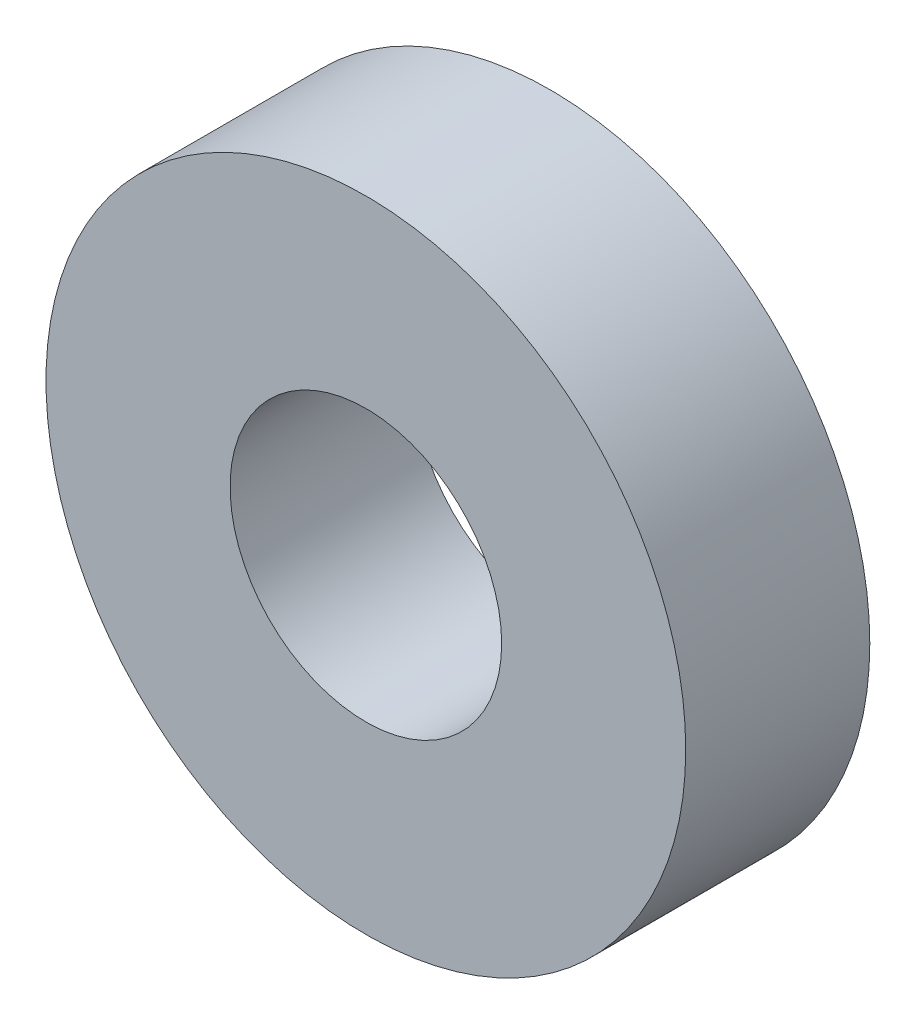
ISO-10303-21;
HEADER;
FILE_DESCRIPTION(('STEP AP214'),'2;1');
FILE_NAME('part.step','',(''),(''),'','','');
FILE_SCHEMA(('AUTOMOTIVE_DESIGN { 1 0 10303 214 1 1 1 1 }'));
ENDSEC;
DATA;
#1=APPLICATION_CONTEXT('core data for automotive mechanical design processes');
#2=APPLICATION_PROTOCOL_DEFINITION('international standard','automotive_design',2000,#1);
#3=PRODUCT_CONTEXT('',#1,'mechanical');
#4=PRODUCT('Part','Part','',(#3));
#5=PRODUCT_RELATED_PRODUCT_CATEGORY('part','',(#4));
#6=PRODUCT_DEFINITION_FORMATION('','',#4);
#7=PRODUCT_DEFINITION_CONTEXT('part definition',#1,'design');
#8=PRODUCT_DEFINITION('design','',#6,#7);
#9=PRODUCT_DEFINITION_SHAPE('','',#8);
#10=(LENGTH_UNIT() NAMED_UNIT(*) SI_UNIT(.MILLI.,.METRE.));
#11=(NAMED_UNIT(*) PLANE_ANGLE_UNIT() SI_UNIT($,.RADIAN.));
#12=(NAMED_UNIT(*) SI_UNIT($,.STERADIAN.) SOLID_ANGLE_UNIT());
#13=UNCERTAINTY_MEASURE_WITH_UNIT(LENGTH_MEASURE(1.E-05),#10,'distance_accuracy_value','');
#14=(GEOMETRIC_REPRESENTATION_CONTEXT(3) GLOBAL_UNCERTAINTY_ASSIGNED_CONTEXT((#13)) GLOBAL_UNIT_ASSIGNED_CONTEXT((#10,
#11,#12)) REPRESENTATION_CONTEXT('',''));
#15=CARTESIAN_POINT('',(0.,0.,0.));
#16=DIRECTION('',(0.,0.,1.));
#17=DIRECTION('',(1.,0.,0.));
#18=AXIS2_PLACEMENT_3D('',#15,#16,#17);
#19=CARTESIAN_POINT('',(-82.5618773380587,31.810605680252,25.4));
#20=DIRECTION('',(0.,0.,1.));
#21=DIRECTION('',(1.,0.,0.));
#22=AXIS2_PLACEMENT_3D('',#19,#20,#21);
#23=PLANE('',#22);
#24=CARTESIAN_POINT('',(-82.5618773380587,31.810605680252,25.4));
#25=DIRECTION('',(0.,0.,1.));
#26=DIRECTION('',(1.,0.,0.));
#27=AXIS2_PLACEMENT_3D('',#24,#25,#26);
#28=CIRCLE('',#27,44.137106544);
#29=CARTESIAN_POINT('',(-38.4247707940587,31.810605680252,25.4));
#30=VERTEX_POINT('',#29);
#31=EDGE_CURVE('E10',#30,#30,#28,.T.);
#32=ORIENTED_EDGE('',*,*,#31,.T.);
#33=EDGE_LOOP('',(#32));
#34=FACE_BOUND('',#33,.T.);
#35=CARTESIAN_POINT('',(-82.5618773380587,31.810605680252,25.4));
#36=DIRECTION('',(0.,0.,1.));
#37=DIRECTION('',(1.,0.,0.));
#38=AXIS2_PLACEMENT_3D('',#35,#36,#37);
#39=CIRCLE('',#38,18.737106544);
#40=CARTESIAN_POINT('',(-63.8247707940587,31.810605680252,25.4));
#41=VERTEX_POINT('',#40);
#42=EDGE_CURVE('E46',#41,#41,#39,.T.);
#43=ORIENTED_EDGE('',*,*,#42,.F.);
#44=EDGE_LOOP('',(#43));
#45=FACE_BOUND('',#44,.T.);
#46=ADVANCED_FACE('F35',(#34,#45),#23,.T.);
#47=CARTESIAN_POINT('',(-82.5618773380587,31.810605680252,0.));
#48=DIRECTION('',(0.,0.,1.));
#49=DIRECTION('',(1.,0.,0.));
#50=AXIS2_PLACEMENT_3D('',#47,#48,#49);
#51=PLANE('',#50);
#52=CARTESIAN_POINT('',(-82.5618773380587,31.810605680252,0.));
#53=DIRECTION('',(0.,0.,1.));
#54=DIRECTION('',(1.,0.,0.));
#55=AXIS2_PLACEMENT_3D('',#52,#53,#54);
#56=CIRCLE('',#55,44.137106544);
#57=CARTESIAN_POINT('',(-38.4247707940587,31.810605680252,0.));
#58=VERTEX_POINT('',#57);
#59=EDGE_CURVE('E39',#58,#58,#56,.T.);
#60=ORIENTED_EDGE('',*,*,#59,.F.);
#61=EDGE_LOOP('',(#60));
#62=FACE_BOUND('',#61,.T.);
#63=CARTESIAN_POINT('',(-82.5618773380587,31.810605680252,0.));
#64=DIRECTION('',(0.,0.,1.));
#65=DIRECTION('',(1.,0.,0.));
#66=AXIS2_PLACEMENT_3D('',#63,#64,#65);
#67=CIRCLE('',#66,18.737106544);
#68=CARTESIAN_POINT('',(-63.8247707940587,31.810605680252,0.));
#69=VERTEX_POINT('',#68);
#70=EDGE_CURVE('E48',#69,#69,#67,.T.);
#71=ORIENTED_EDGE('',*,*,#70,.T.);
#72=EDGE_LOOP('',(#71));
#73=FACE_BOUND('',#72,.T.);
#74=ADVANCED_FACE('F58',(#62,#73),#51,.F.);
#75=CARTESIAN_POINT('',(-82.5618773380587,31.810605680252,25.4));
#76=DIRECTION('',(0.,0.,-1.));
#77=DIRECTION('',(-1.,0.,0.));
#78=AXIS2_PLACEMENT_3D('',#75,#76,#77);
#79=CYLINDRICAL_SURFACE('',#78,44.137106544);
#80=ORIENTED_EDGE('',*,*,#31,.F.);
#81=EDGE_LOOP('',(#80));
#82=FACE_BOUND('',#81,.T.);
#83=ORIENTED_EDGE('',*,*,#59,.T.);
#84=EDGE_LOOP('',(#83));
#85=FACE_BOUND('',#84,.T.);
#86=ADVANCED_FACE('F37',(#82,#85),#79,.T.);
#87=CARTESIAN_POINT('',(-82.5618773380587,31.810605680252,25.4));
#88=DIRECTION('',(0.,0.,-1.));
#89=DIRECTION('',(-1.,0.,0.));
#90=AXIS2_PLACEMENT_3D('',#87,#88,#89);
#91=CYLINDRICAL_SURFACE('',#90,18.737106544);
#92=ORIENTED_EDGE('',*,*,#42,.T.);
#93=EDGE_LOOP('',(#92));
#94=FACE_BOUND('',#93,.T.);
#95=ORIENTED_EDGE('',*,*,#70,.F.);
#96=EDGE_LOOP('',(#95));
#97=FACE_BOUND('',#96,.T.);
#98=ADVANCED_FACE('F54',(#94,#97),#91,.F.);
#99=CLOSED_SHELL('',(#46,#74,#86,#98));
#100=MANIFOLD_SOLID_BREP('B2',#99);
#101=ADVANCED_BREP_SHAPE_REPRESENTATION('',(#18,#100),#14);
#102=SHAPE_DEFINITION_REPRESENTATION(#9,#101);
ENDSEC;
END-ISO-10303-21;
